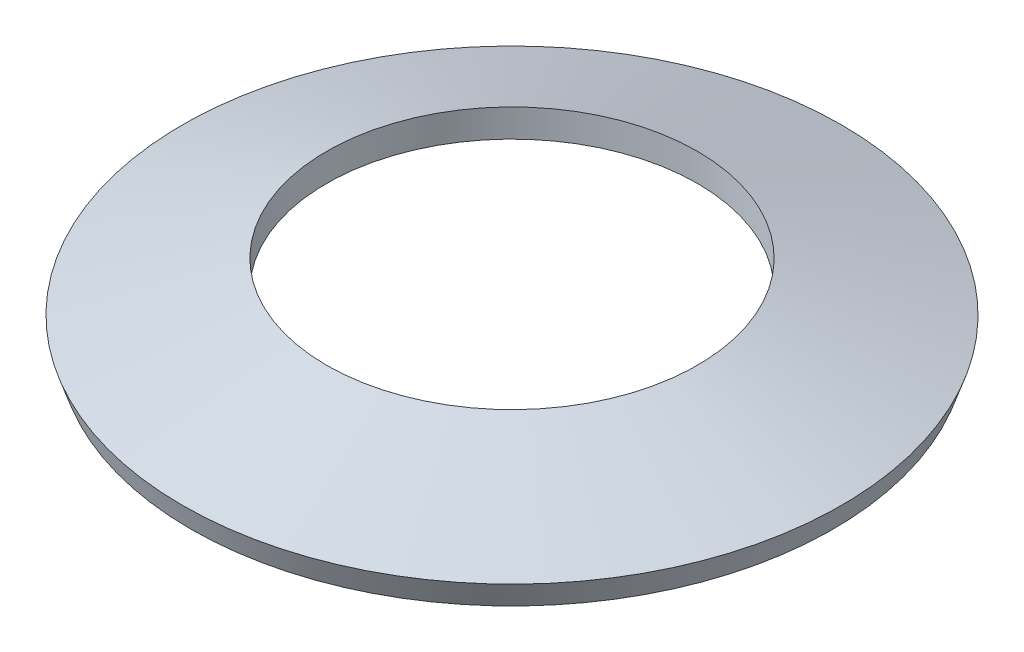
ISO-10303-21;
HEADER;
FILE_DESCRIPTION(('STEP AP214'),'2;1');
FILE_NAME('part.step','',(''),(''),'','','');
FILE_SCHEMA(('AUTOMOTIVE_DESIGN { 1 0 10303 214 1 1 1 1 }'));
ENDSEC;
DATA;
#1=APPLICATION_CONTEXT('core data for automotive mechanical design processes');
#2=APPLICATION_PROTOCOL_DEFINITION('international standard','automotive_design',2000,#1);
#3=PRODUCT_CONTEXT('',#1,'mechanical');
#4=PRODUCT('Part','Part','',(#3));
#5=PRODUCT_RELATED_PRODUCT_CATEGORY('part','',(#4));
#6=PRODUCT_DEFINITION_FORMATION('','',#4);
#7=PRODUCT_DEFINITION_CONTEXT('part definition',#1,'design');
#8=PRODUCT_DEFINITION('design','',#6,#7);
#9=PRODUCT_DEFINITION_SHAPE('','',#8);
#10=(LENGTH_UNIT() NAMED_UNIT(*) SI_UNIT(.MILLI.,.METRE.));
#11=(NAMED_UNIT(*) PLANE_ANGLE_UNIT() SI_UNIT($,.RADIAN.));
#12=(NAMED_UNIT(*) SI_UNIT($,.STERADIAN.) SOLID_ANGLE_UNIT());
#13=UNCERTAINTY_MEASURE_WITH_UNIT(LENGTH_MEASURE(1.E-05),#10,'distance_accuracy_value','');
#14=(GEOMETRIC_REPRESENTATION_CONTEXT(3) GLOBAL_UNCERTAINTY_ASSIGNED_CONTEXT((#13)) GLOBAL_UNIT_ASSIGNED_CONTEXT((#10,
#11,#12)) REPRESENTATION_CONTEXT('',''));
#15=CARTESIAN_POINT('',(0.,0.,0.));
#16=DIRECTION('',(0.,0.,1.));
#17=DIRECTION('',(1.,0.,0.));
#18=AXIS2_PLACEMENT_3D('',#15,#16,#17);
#19=CARTESIAN_POINT('',(36.9752169295715,-17.3371426298124,10.4000283791901));
#20=DIRECTION('',(0.,-1.,0.));
#21=DIRECTION('',(0.,0.,-1.));
#22=AXIS2_PLACEMENT_3D('',#19,#20,#21);
#23=CONICAL_SURFACE('',#22,4.5,1.24195896551129);
#24=CARTESIAN_POINT('',(36.9752169295715,-18.5314348224409,10.4000283791901));
#25=DIRECTION('',(0.,1.,0.));
#26=DIRECTION('',(0.,0.,1.));
#27=AXIS2_PLACEMENT_3D('',#24,#25,#26);
#28=CIRCLE('',#27,8.);
#29=CARTESIAN_POINT('',(36.9752169295715,-18.5314348224409,18.4000283791901));
#30=VERTEX_POINT('',#29);
#31=EDGE_CURVE('E10',#30,#30,#28,.T.);
#32=ORIENTED_EDGE('',*,*,#31,.T.);
#33=EDGE_LOOP('',(#32));
#34=FACE_BOUND('',#33,.T.);
#35=CARTESIAN_POINT('',(36.9752169295715,-17.3371426298124,10.4000283791901));
#36=DIRECTION('',(0.,1.,0.));
#37=DIRECTION('',(0.,0.,1.));
#38=AXIS2_PLACEMENT_3D('',#35,#36,#37);
#39=CIRCLE('',#38,4.5);
#40=CARTESIAN_POINT('',(36.9752169295715,-17.3371426298124,14.9000283791901));
#41=VERTEX_POINT('',#40);
#42=EDGE_CURVE('E40',#41,#41,#39,.T.);
#43=ORIENTED_EDGE('',*,*,#42,.F.);
#44=EDGE_LOOP('',(#43));
#45=FACE_BOUND('',#44,.T.);
#46=ADVANCED_FACE('F26',(#34,#45),#23,.T.);
#47=CARTESIAN_POINT('',(36.9752169295715,-18.5314348224409,10.4000283791901));
#48=DIRECTION('',(0.,1.,0.));
#49=DIRECTION('',(0.,0.,1.));
#50=AXIS2_PLACEMENT_3D('',#47,#48,#49);
#51=CONICAL_SURFACE('',#50,8.,0.328837361283609);
#52=CARTESIAN_POINT('',(36.9752169295715,-19.1371426298123,10.4000283791901));
#53=DIRECTION('',(0.,1.,0.));
#54=DIRECTION('',(0.,0.,1.));
#55=AXIS2_PLACEMENT_3D('',#52,#53,#54);
#56=CIRCLE('',#55,7.79331654132633);
#57=CARTESIAN_POINT('',(36.9752169295715,-19.1371426298123,18.1933449205164));
#58=VERTEX_POINT('',#57);
#59=EDGE_CURVE('E32',#58,#58,#56,.T.);
#60=ORIENTED_EDGE('',*,*,#59,.T.);
#61=EDGE_LOOP('',(#60));
#62=FACE_BOUND('',#61,.T.);
#63=ORIENTED_EDGE('',*,*,#31,.F.);
#64=EDGE_LOOP('',(#63));
#65=FACE_BOUND('',#64,.T.);
#66=ADVANCED_FACE('F50',(#62,#65),#51,.T.);
#67=CARTESIAN_POINT('',(36.9752169295715,-19.1371426298123,10.4000283791901));
#68=DIRECTION('',(0.,-1.,0.));
#69=DIRECTION('',(0.,0.,-1.));
#70=AXIS2_PLACEMENT_3D('',#67,#68,#69);
#71=CONICAL_SURFACE('',#70,7.79331654132633,1.24195896551129);
#72=CARTESIAN_POINT('',(36.9752169295715,-18.0133762774808,10.4000283791901));
#73=DIRECTION('',(0.,1.,0.));
#74=DIRECTION('',(0.,0.,1.));
#75=AXIS2_PLACEMENT_3D('',#72,#73,#74);
#76=CIRCLE('',#75,4.5);
#77=CARTESIAN_POINT('',(36.9752169295715,-18.0133762774808,14.9000283791901));
#78=VERTEX_POINT('',#77);
#79=EDGE_CURVE('E36',#78,#78,#76,.T.);
#80=ORIENTED_EDGE('',*,*,#79,.T.);
#81=EDGE_LOOP('',(#80));
#82=FACE_BOUND('',#81,.T.);
#83=ORIENTED_EDGE('',*,*,#59,.F.);
#84=EDGE_LOOP('',(#83));
#85=FACE_BOUND('',#84,.T.);
#86=ADVANCED_FACE('F54',(#82,#85),#71,.F.);
#87=CARTESIAN_POINT('',(36.9752169295715,-19.1605706044099,10.4000283791901));
#88=DIRECTION('',(0.,1.,0.));
#89=DIRECTION('',(0.,0.,1.));
#90=AXIS2_PLACEMENT_3D('',#87,#88,#89);
#91=CYLINDRICAL_SURFACE('',#90,4.5);
#92=ORIENTED_EDGE('',*,*,#42,.T.);
#93=EDGE_LOOP('',(#92));
#94=FACE_BOUND('',#93,.T.);
#95=ORIENTED_EDGE('',*,*,#79,.F.);
#96=EDGE_LOOP('',(#95));
#97=FACE_BOUND('',#96,.T.);
#98=ADVANCED_FACE('F46',(#94,#97),#91,.F.);
#99=CLOSED_SHELL('',(#46,#66,#86,#98));
#100=MANIFOLD_SOLID_BREP('B2',#99);
#101=ADVANCED_BREP_SHAPE_REPRESENTATION('',(#18,#100),#14);
#102=SHAPE_DEFINITION_REPRESENTATION(#9,#101);
ENDSEC;
END-ISO-10303-21;
